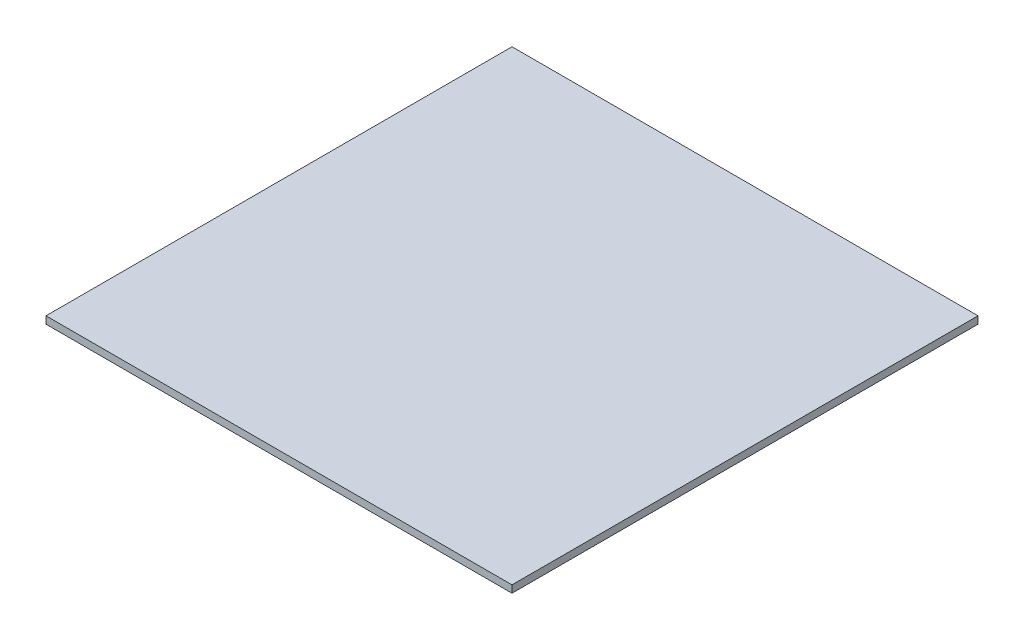
ISO-10303-21;
HEADER;
FILE_DESCRIPTION(('STEP AP214'),'2;1');
FILE_NAME('part.step','',(''),(''),'','','');
FILE_SCHEMA(('AUTOMOTIVE_DESIGN { 1 0 10303 214 1 1 1 1 }'));
ENDSEC;
DATA;
#1=APPLICATION_CONTEXT('core data for automotive mechanical design processes');
#2=APPLICATION_PROTOCOL_DEFINITION('international standard','automotive_design',2000,#1);
#3=PRODUCT_CONTEXT('',#1,'mechanical');
#4=PRODUCT('Part','Part','',(#3));
#5=PRODUCT_RELATED_PRODUCT_CATEGORY('part','',(#4));
#6=PRODUCT_DEFINITION_FORMATION('','',#4);
#7=PRODUCT_DEFINITION_CONTEXT('part definition',#1,'design');
#8=PRODUCT_DEFINITION('design','',#6,#7);
#9=PRODUCT_DEFINITION_SHAPE('','',#8);
#10=(LENGTH_UNIT() NAMED_UNIT(*) SI_UNIT(.MILLI.,.METRE.));
#11=(NAMED_UNIT(*) PLANE_ANGLE_UNIT() SI_UNIT($,.RADIAN.));
#12=(NAMED_UNIT(*) SI_UNIT($,.STERADIAN.) SOLID_ANGLE_UNIT());
#13=UNCERTAINTY_MEASURE_WITH_UNIT(LENGTH_MEASURE(1.E-05),#10,'distance_accuracy_value','');
#14=(GEOMETRIC_REPRESENTATION_CONTEXT(3) GLOBAL_UNCERTAINTY_ASSIGNED_CONTEXT((#13)) GLOBAL_UNIT_ASSIGNED_CONTEXT((#10,
#11,#12)) REPRESENTATION_CONTEXT('',''));
#15=CARTESIAN_POINT('',(0.,0.,0.));
#16=DIRECTION('',(0.,0.,1.));
#17=DIRECTION('',(1.,0.,0.));
#18=AXIS2_PLACEMENT_3D('',#15,#16,#17);
#19=CARTESIAN_POINT('',(304.8,9.525,304.8));
#20=DIRECTION('',(-1.,0.,0.));
#21=DIRECTION('',(0.,0.,1.));
#22=AXIS2_PLACEMENT_3D('',#19,#20,#21);
#23=PLANE('',#22);
#24=DIRECTION('',(0.,0.,-1.));
#25=VECTOR('',#24,1.);
#26=CARTESIAN_POINT('',(304.8,0.,304.8));
#27=LINE('',#26,#25);
#28=CARTESIAN_POINT('',(304.8,0.,304.8));
#29=VERTEX_POINT('',#28);
#30=CARTESIAN_POINT('',(304.8,0.,-304.8));
#31=VERTEX_POINT('',#30);
#32=EDGE_CURVE('E107',#29,#31,#27,.T.);
#33=ORIENTED_EDGE('',*,*,#32,.T.);
#34=DIRECTION('',(0.,-1.,0.));
#35=VECTOR('',#34,1.);
#36=CARTESIAN_POINT('',(304.8,9.525,-304.8));
#37=LINE('',#36,#35);
#38=CARTESIAN_POINT('',(304.8,9.525,-304.8));
#39=VERTEX_POINT('',#38);
#40=EDGE_CURVE('E11',#39,#31,#37,.T.);
#41=ORIENTED_EDGE('',*,*,#40,.F.);
#42=DIRECTION('',(0.,0.,-1.));
#43=VECTOR('',#42,1.);
#44=CARTESIAN_POINT('',(304.8,9.525,304.8));
#45=LINE('',#44,#43);
#46=CARTESIAN_POINT('',(304.8,9.525,304.8));
#47=VERTEX_POINT('',#46);
#48=EDGE_CURVE('E91',#47,#39,#45,.T.);
#49=ORIENTED_EDGE('',*,*,#48,.F.);
#50=DIRECTION('',(0.,-1.,0.));
#51=VECTOR('',#50,1.);
#52=CARTESIAN_POINT('',(304.8,9.525,304.8));
#53=LINE('',#52,#51);
#54=EDGE_CURVE('E103',#47,#29,#53,.T.);
#55=ORIENTED_EDGE('',*,*,#54,.T.);
#56=EDGE_LOOP('',(#33,#41,#49,#55));
#57=FACE_BOUND('',#56,.T.);
#58=ADVANCED_FACE('F39',(#57),#23,.F.);
#59=CARTESIAN_POINT('',(-304.8,9.525,-304.8));
#60=DIRECTION('',(0.,0.,1.));
#61=DIRECTION('',(1.,0.,0.));
#62=AXIS2_PLACEMENT_3D('',#59,#60,#61);
#63=PLANE('',#62);
#64=DIRECTION('',(-1.,0.,0.));
#65=VECTOR('',#64,1.);
#66=CARTESIAN_POINT('',(-304.8,0.,-304.8));
#67=LINE('',#66,#65);
#68=CARTESIAN_POINT('',(-304.8,0.,-304.8));
#69=VERTEX_POINT('',#68);
#70=EDGE_CURVE('E96',#31,#69,#67,.T.);
#71=ORIENTED_EDGE('',*,*,#70,.T.);
#72=DIRECTION('',(0.,-1.,0.));
#73=VECTOR('',#72,1.);
#74=CARTESIAN_POINT('',(-304.8,9.525,-304.8));
#75=LINE('',#74,#73);
#76=CARTESIAN_POINT('',(-304.8,9.525,-304.8));
#77=VERTEX_POINT('',#76);
#78=EDGE_CURVE('E48',#77,#69,#75,.T.);
#79=ORIENTED_EDGE('',*,*,#78,.F.);
#80=DIRECTION('',(-1.,0.,0.));
#81=VECTOR('',#80,1.);
#82=CARTESIAN_POINT('',(-304.8,9.525,-304.8));
#83=LINE('',#82,#81);
#84=EDGE_CURVE('E86',#39,#77,#83,.T.);
#85=ORIENTED_EDGE('',*,*,#84,.F.);
#86=ORIENTED_EDGE('',*,*,#40,.T.);
#87=EDGE_LOOP('',(#71,#79,#85,#86));
#88=FACE_BOUND('',#87,.T.);
#89=ADVANCED_FACE('F95',(#88),#63,.F.);
#90=CARTESIAN_POINT('',(-304.8,9.525,304.8));
#91=DIRECTION('',(1.,0.,0.));
#92=DIRECTION('',(0.,0.,-1.));
#93=AXIS2_PLACEMENT_3D('',#90,#91,#92);
#94=PLANE('',#93);
#95=DIRECTION('',(0.,0.,1.));
#96=VECTOR('',#95,1.);
#97=CARTESIAN_POINT('',(-304.8,0.,304.8));
#98=LINE('',#97,#96);
#99=CARTESIAN_POINT('',(-304.8,0.,304.8));
#100=VERTEX_POINT('',#99);
#101=EDGE_CURVE('E73',#69,#100,#98,.T.);
#102=ORIENTED_EDGE('',*,*,#101,.T.);
#103=DIRECTION('',(0.,-1.,0.));
#104=VECTOR('',#103,1.);
#105=CARTESIAN_POINT('',(-304.8,9.525,304.8));
#106=LINE('',#105,#104);
#107=CARTESIAN_POINT('',(-304.8,9.525,304.8));
#108=VERTEX_POINT('',#107);
#109=EDGE_CURVE('E98',#108,#100,#106,.T.);
#110=ORIENTED_EDGE('',*,*,#109,.F.);
#111=DIRECTION('',(0.,0.,1.));
#112=VECTOR('',#111,1.);
#113=CARTESIAN_POINT('',(-304.8,9.525,304.8));
#114=LINE('',#113,#112);
#115=EDGE_CURVE('E89',#77,#108,#114,.T.);
#116=ORIENTED_EDGE('',*,*,#115,.F.);
#117=ORIENTED_EDGE('',*,*,#78,.T.);
#118=EDGE_LOOP('',(#102,#110,#116,#117));
#119=FACE_BOUND('',#118,.T.);
#120=ADVANCED_FACE('F99',(#119),#94,.F.);
#121=CARTESIAN_POINT('',(-304.8,9.525,304.8));
#122=DIRECTION('',(0.,0.,-1.));
#123=DIRECTION('',(-1.,0.,0.));
#124=AXIS2_PLACEMENT_3D('',#121,#122,#123);
#125=PLANE('',#124);
#126=DIRECTION('',(1.,0.,0.));
#127=VECTOR('',#126,1.);
#128=CARTESIAN_POINT('',(-304.8,0.,304.8));
#129=LINE('',#128,#127);
#130=EDGE_CURVE('E79',#100,#29,#129,.T.);
#131=ORIENTED_EDGE('',*,*,#130,.T.);
#132=ORIENTED_EDGE('',*,*,#54,.F.);
#133=DIRECTION('',(1.,0.,0.));
#134=VECTOR('',#133,1.);
#135=CARTESIAN_POINT('',(-304.8,9.525,304.8));
#136=LINE('',#135,#134);
#137=EDGE_CURVE('E56',#108,#47,#136,.T.);
#138=ORIENTED_EDGE('',*,*,#137,.F.);
#139=ORIENTED_EDGE('',*,*,#109,.T.);
#140=EDGE_LOOP('',(#131,#132,#138,#139));
#141=FACE_BOUND('',#140,.T.);
#142=ADVANCED_FACE('F120',(#141),#125,.F.);
#143=CARTESIAN_POINT('',(0.,9.525,0.));
#144=DIRECTION('',(0.,-1.,0.));
#145=DIRECTION('',(0.,0.,-1.));
#146=AXIS2_PLACEMENT_3D('',#143,#144,#145);
#147=PLANE('',#146);
#148=ORIENTED_EDGE('',*,*,#48,.T.);
#149=ORIENTED_EDGE('',*,*,#84,.T.);
#150=ORIENTED_EDGE('',*,*,#115,.T.);
#151=ORIENTED_EDGE('',*,*,#137,.T.);
#152=EDGE_LOOP('',(#148,#149,#150,#151));
#153=FACE_BOUND('',#152,.T.);
#154=ADVANCED_FACE('F87',(#153),#147,.F.);
#155=CARTESIAN_POINT('',(0.,0.,0.));
#156=DIRECTION('',(0.,-1.,0.));
#157=DIRECTION('',(0.,0.,-1.));
#158=AXIS2_PLACEMENT_3D('',#155,#156,#157);
#159=PLANE('',#158);
#160=ORIENTED_EDGE('',*,*,#32,.F.);
#161=ORIENTED_EDGE('',*,*,#130,.F.);
#162=ORIENTED_EDGE('',*,*,#101,.F.);
#163=ORIENTED_EDGE('',*,*,#70,.F.);
#164=EDGE_LOOP('',(#160,#161,#162,#163));
#165=FACE_BOUND('',#164,.T.);
#166=ADVANCED_FACE('F123',(#165),#159,.T.);
#167=CLOSED_SHELL('',(#58,#89,#120,#142,#154,#166));
#168=MANIFOLD_SOLID_BREP('B2',#167);
#169=ADVANCED_BREP_SHAPE_REPRESENTATION('',(#18,#168),#14);
#170=SHAPE_DEFINITION_REPRESENTATION(#9,#169);
ENDSEC;
END-ISO-10303-21;
